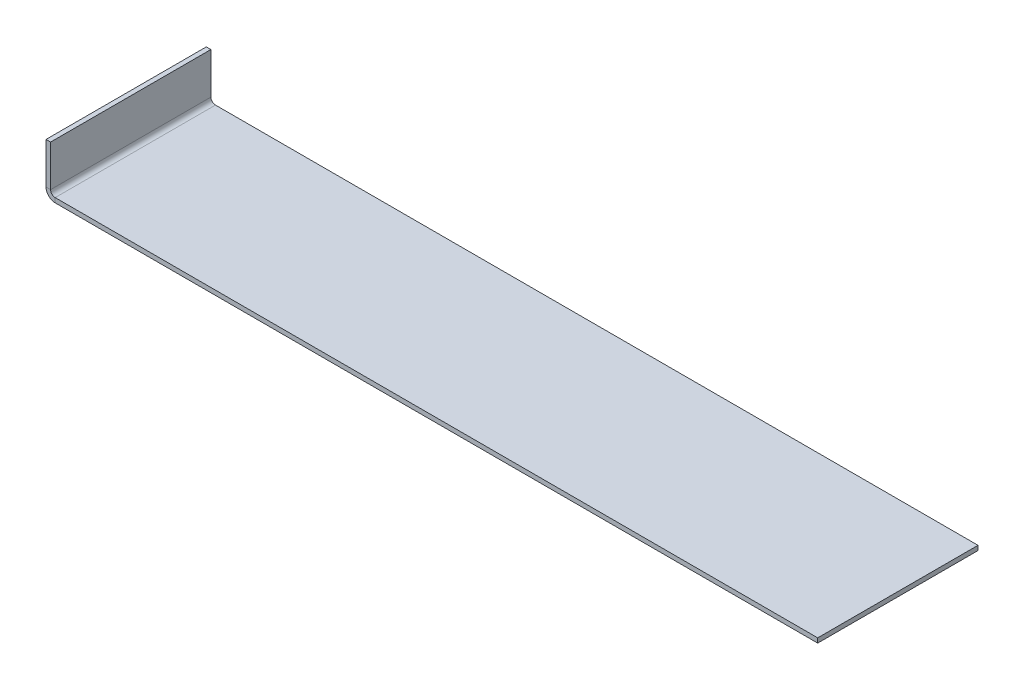
ISO-10303-21;
HEADER;
FILE_DESCRIPTION(('STEP AP214'),'2;1');
FILE_NAME('part.step','',(''),(''),'','','');
FILE_SCHEMA(('AUTOMOTIVE_DESIGN { 1 0 10303 214 1 1 1 1 }'));
ENDSEC;
DATA;
#1=APPLICATION_CONTEXT('core data for automotive mechanical design processes');
#2=APPLICATION_PROTOCOL_DEFINITION('international standard','automotive_design',2000,#1);
#3=PRODUCT_CONTEXT('',#1,'mechanical');
#4=PRODUCT('Part','Part','',(#3));
#5=PRODUCT_RELATED_PRODUCT_CATEGORY('part','',(#4));
#6=PRODUCT_DEFINITION_FORMATION('','',#4);
#7=PRODUCT_DEFINITION_CONTEXT('part definition',#1,'design');
#8=PRODUCT_DEFINITION('design','',#6,#7);
#9=PRODUCT_DEFINITION_SHAPE('','',#8);
#10=(LENGTH_UNIT() NAMED_UNIT(*) SI_UNIT(.MILLI.,.METRE.));
#11=(NAMED_UNIT(*) PLANE_ANGLE_UNIT() SI_UNIT($,.RADIAN.));
#12=(NAMED_UNIT(*) SI_UNIT($,.STERADIAN.) SOLID_ANGLE_UNIT());
#13=UNCERTAINTY_MEASURE_WITH_UNIT(LENGTH_MEASURE(1.E-05),#10,'distance_accuracy_value','');
#14=(GEOMETRIC_REPRESENTATION_CONTEXT(3) GLOBAL_UNCERTAINTY_ASSIGNED_CONTEXT((#13)) GLOBAL_UNIT_ASSIGNED_CONTEXT((#10,
#11,#12)) REPRESENTATION_CONTEXT('',''));
#15=CARTESIAN_POINT('',(0.,0.,0.));
#16=DIRECTION('',(0.,0.,1.));
#17=DIRECTION('',(1.,0.,0.));
#18=AXIS2_PLACEMENT_3D('',#15,#16,#17);
#19=CARTESIAN_POINT('',(2.,0.,35.));
#20=DIRECTION('',(0.,0.,1.));
#21=DIRECTION('',(1.,0.,0.));
#22=AXIS2_PLACEMENT_3D('',#19,#20,#21);
#23=PLANE('',#22);
#24=DIRECTION('',(0.,-1.,0.));
#25=VECTOR('',#24,1.);
#26=CARTESIAN_POINT('',(2.,0.,35.));
#27=LINE('',#26,#25);
#28=CARTESIAN_POINT('',(2.,0.,35.));
#29=VERTEX_POINT('',#28);
#30=CARTESIAN_POINT('',(2.,-2.,35.));
#31=VERTEX_POINT('',#30);
#32=EDGE_CURVE('E11',#29,#31,#27,.T.);
#33=ORIENTED_EDGE('',*,*,#32,.F.);
#34=CARTESIAN_POINT('',(2.,2.,35.));
#35=DIRECTION('',(0.,0.,-1.));
#36=DIRECTION('',(-1.,0.,0.));
#37=AXIS2_PLACEMENT_3D('',#34,#35,#36);
#38=CIRCLE('',#37,2.);
#39=CARTESIAN_POINT('',(0.,2.,35.));
#40=VERTEX_POINT('',#39);
#41=EDGE_CURVE('E138',#40,#29,#38,.F.);
#42=ORIENTED_EDGE('',*,*,#41,.F.);
#43=DIRECTION('',(1.,0.,0.));
#44=VECTOR('',#43,1.);
#45=CARTESIAN_POINT('',(-2.,2.,35.));
#46=LINE('',#45,#44);
#47=CARTESIAN_POINT('',(-2.,2.,35.));
#48=VERTEX_POINT('',#47);
#49=EDGE_CURVE('E49',#48,#40,#46,.T.);
#50=ORIENTED_EDGE('',*,*,#49,.F.);
#51=CARTESIAN_POINT('',(2.,2.,35.));
#52=DIRECTION('',(0.,0.,1.));
#53=DIRECTION('',(1.,0.,0.));
#54=AXIS2_PLACEMENT_3D('',#51,#52,#53);
#55=CIRCLE('',#54,4.);
#56=EDGE_CURVE('E131',#48,#31,#55,.T.);
#57=ORIENTED_EDGE('',*,*,#56,.T.);
#58=EDGE_LOOP('',(#33,#42,#50,#57));
#59=FACE_BOUND('',#58,.T.);
#60=ADVANCED_FACE('F41',(#59),#23,.T.);
#61=CARTESIAN_POINT('',(-2.,2.,35.));
#62=DIRECTION('',(0.,0.,1.));
#63=DIRECTION('',(1.,0.,0.));
#64=AXIS2_PLACEMENT_3D('',#61,#62,#63);
#65=PLANE('',#64);
#66=DIRECTION('',(1.,0.,0.));
#67=VECTOR('',#66,1.);
#68=CARTESIAN_POINT('',(0.,0.,35.));
#69=LINE('',#68,#67);
#70=CARTESIAN_POINT('',(335.,0.,35.));
#71=VERTEX_POINT('',#70);
#72=EDGE_CURVE('E187',#29,#71,#69,.T.);
#73=ORIENTED_EDGE('',*,*,#72,.F.);
#74=ORIENTED_EDGE('',*,*,#32,.T.);
#75=DIRECTION('',(1.,0.,0.));
#76=VECTOR('',#75,1.);
#77=CARTESIAN_POINT('',(0.,-2.,35.));
#78=LINE('',#77,#76);
#79=CARTESIAN_POINT('',(335.,-2.,35.));
#80=VERTEX_POINT('',#79);
#81=EDGE_CURVE('E97',#31,#80,#78,.T.);
#82=ORIENTED_EDGE('',*,*,#81,.T.);
#83=DIRECTION('',(0.,-1.,0.));
#84=VECTOR('',#83,1.);
#85=CARTESIAN_POINT('',(335.,0.,35.));
#86=LINE('',#85,#84);
#87=EDGE_CURVE('E344',#71,#80,#86,.T.);
#88=ORIENTED_EDGE('',*,*,#87,.F.);
#89=EDGE_LOOP('',(#73,#74,#82,#88));
#90=FACE_BOUND('',#89,.T.);
#91=ADVANCED_FACE('F195',(#90),#65,.T.);
#92=CARTESIAN_POINT('',(0.,2.,-35.));
#93=DIRECTION('',(0.,0.,-1.));
#94=DIRECTION('',(-1.,0.,0.));
#95=AXIS2_PLACEMENT_3D('',#92,#93,#94);
#96=PLANE('',#95);
#97=DIRECTION('',(-1.,0.,0.));
#98=VECTOR('',#97,1.);
#99=CARTESIAN_POINT('',(0.,2.,-35.));
#100=LINE('',#99,#98);
#101=CARTESIAN_POINT('',(0.,2.,-35.));
#102=VERTEX_POINT('',#101);
#103=CARTESIAN_POINT('',(-2.,2.,-35.));
#104=VERTEX_POINT('',#103);
#105=EDGE_CURVE('E84',#102,#104,#100,.T.);
#106=ORIENTED_EDGE('',*,*,#105,.F.);
#107=CARTESIAN_POINT('',(2.,2.,-35.));
#108=DIRECTION('',(0.,0.,-1.));
#109=DIRECTION('',(-1.,0.,0.));
#110=AXIS2_PLACEMENT_3D('',#107,#108,#109);
#111=CIRCLE('',#110,2.);
#112=CARTESIAN_POINT('',(2.,0.,-35.));
#113=VERTEX_POINT('',#112);
#114=EDGE_CURVE('E153',#102,#113,#111,.F.);
#115=ORIENTED_EDGE('',*,*,#114,.T.);
#116=DIRECTION('',(0.,1.,0.));
#117=VECTOR('',#116,1.);
#118=CARTESIAN_POINT('',(2.,-2.,-35.));
#119=LINE('',#118,#117);
#120=CARTESIAN_POINT('',(2.,-2.,-35.));
#121=VERTEX_POINT('',#120);
#122=EDGE_CURVE('E91',#121,#113,#119,.T.);
#123=ORIENTED_EDGE('',*,*,#122,.F.);
#124=CARTESIAN_POINT('',(2.,2.,-35.));
#125=DIRECTION('',(0.,0.,1.));
#126=DIRECTION('',(1.,0.,0.));
#127=AXIS2_PLACEMENT_3D('',#124,#125,#126);
#128=CIRCLE('',#127,4.);
#129=EDGE_CURVE('E160',#104,#121,#128,.T.);
#130=ORIENTED_EDGE('',*,*,#129,.F.);
#131=EDGE_LOOP('',(#106,#115,#123,#130));
#132=FACE_BOUND('',#131,.T.);
#133=ADVANCED_FACE('F193',(#132),#96,.T.);
#134=CARTESIAN_POINT('',(2.,-2.,-35.));
#135=DIRECTION('',(0.,0.,-1.));
#136=DIRECTION('',(-1.,0.,0.));
#137=AXIS2_PLACEMENT_3D('',#134,#135,#136);
#138=PLANE('',#137);
#139=DIRECTION('',(0.,-1.,0.));
#140=VECTOR('',#139,1.);
#141=CARTESIAN_POINT('',(0.,20.,-35.));
#142=LINE('',#141,#140);
#143=CARTESIAN_POINT('',(0.,20.,-35.));
#144=VERTEX_POINT('',#143);
#145=EDGE_CURVE('E155',#144,#102,#142,.T.);
#146=ORIENTED_EDGE('',*,*,#145,.T.);
#147=ORIENTED_EDGE('',*,*,#105,.T.);
#148=DIRECTION('',(0.,1.,0.));
#149=VECTOR('',#148,1.);
#150=CARTESIAN_POINT('',(-2.,20.,-35.));
#151=LINE('',#150,#149);
#152=CARTESIAN_POINT('',(-2.,20.,-35.));
#153=VERTEX_POINT('',#152);
#154=EDGE_CURVE('E158',#153,#104,#151,.F.);
#155=ORIENTED_EDGE('',*,*,#154,.F.);
#156=DIRECTION('',(1.,0.,0.));
#157=VECTOR('',#156,1.);
#158=CARTESIAN_POINT('',(-2.,20.,-35.));
#159=LINE('',#158,#157);
#160=EDGE_CURVE('E119',#153,#144,#159,.T.);
#161=ORIENTED_EDGE('',*,*,#160,.T.);
#162=EDGE_LOOP('',(#146,#147,#155,#161));
#163=FACE_BOUND('',#162,.T.);
#164=ADVANCED_FACE('F189',(#163),#138,.T.);
#165=CARTESIAN_POINT('',(0.,-2.,35.));
#166=DIRECTION('',(0.,1.,0.));
#167=DIRECTION('',(0.,0.,1.));
#168=AXIS2_PLACEMENT_3D('',#165,#166,#167);
#169=PLANE('',#168);
#170=DIRECTION('',(1.,0.,0.));
#171=VECTOR('',#170,1.);
#172=CARTESIAN_POINT('',(0.,-2.,-35.));
#173=LINE('',#172,#171);
#174=CARTESIAN_POINT('',(335.,-2.,-35.));
#175=VERTEX_POINT('',#174);
#176=EDGE_CURVE('E144',#121,#175,#173,.T.);
#177=ORIENTED_EDGE('',*,*,#176,.T.);
#178=DIRECTION('',(0.,0.,-1.));
#179=VECTOR('',#178,1.);
#180=CARTESIAN_POINT('',(335.,-2.,35.));
#181=LINE('',#180,#179);
#182=EDGE_CURVE('E174',#80,#175,#181,.T.);
#183=ORIENTED_EDGE('',*,*,#182,.F.);
#184=ORIENTED_EDGE('',*,*,#81,.F.);
#185=DIRECTION('',(0.,0.,-1.));
#186=VECTOR('',#185,1.);
#187=CARTESIAN_POINT('',(2.,-2.,35.));
#188=LINE('',#187,#186);
#189=EDGE_CURVE('E143',#31,#121,#188,.T.);
#190=ORIENTED_EDGE('',*,*,#189,.T.);
#191=EDGE_LOOP('',(#177,#183,#184,#190));
#192=FACE_BOUND('',#191,.T.);
#193=ADVANCED_FACE('F201',(#192),#169,.F.);
#194=CARTESIAN_POINT('',(335.,0.,35.));
#195=DIRECTION('',(1.,0.,0.));
#196=DIRECTION('',(0.,0.,-1.));
#197=AXIS2_PLACEMENT_3D('',#194,#195,#196);
#198=PLANE('',#197);
#199=DIRECTION('',(0.,-1.,0.));
#200=VECTOR('',#199,1.);
#201=CARTESIAN_POINT('',(335.,0.,-35.));
#202=LINE('',#201,#200);
#203=CARTESIAN_POINT('',(335.,0.,-35.));
#204=VERTEX_POINT('',#203);
#205=EDGE_CURVE('E147',#204,#175,#202,.T.);
#206=ORIENTED_EDGE('',*,*,#205,.F.);
#207=DIRECTION('',(0.,0.,-1.));
#208=VECTOR('',#207,1.);
#209=CARTESIAN_POINT('',(335.,0.,35.));
#210=LINE('',#209,#208);
#211=EDGE_CURVE('E172',#71,#204,#210,.T.);
#212=ORIENTED_EDGE('',*,*,#211,.F.);
#213=ORIENTED_EDGE('',*,*,#87,.T.);
#214=ORIENTED_EDGE('',*,*,#182,.T.);
#215=EDGE_LOOP('',(#206,#212,#213,#214));
#216=FACE_BOUND('',#215,.T.);
#217=ADVANCED_FACE('F234',(#216),#198,.T.);
#218=CARTESIAN_POINT('',(0.,0.,35.));
#219=DIRECTION('',(0.,1.,0.));
#220=DIRECTION('',(0.,0.,1.));
#221=AXIS2_PLACEMENT_3D('',#218,#219,#220);
#222=PLANE('',#221);
#223=DIRECTION('',(1.,0.,0.));
#224=VECTOR('',#223,1.);
#225=CARTESIAN_POINT('',(0.,0.,-35.));
#226=LINE('',#225,#224);
#227=EDGE_CURVE('E150',#113,#204,#226,.T.);
#228=ORIENTED_EDGE('',*,*,#227,.F.);
#229=DIRECTION('',(0.,0.,-1.));
#230=VECTOR('',#229,1.);
#231=CARTESIAN_POINT('',(2.,0.,35.));
#232=LINE('',#231,#230);
#233=EDGE_CURVE('E169',#29,#113,#232,.T.);
#234=ORIENTED_EDGE('',*,*,#233,.F.);
#235=ORIENTED_EDGE('',*,*,#72,.T.);
#236=ORIENTED_EDGE('',*,*,#211,.T.);
#237=EDGE_LOOP('',(#228,#234,#235,#236));
#238=FACE_BOUND('',#237,.T.);
#239=ADVANCED_FACE('F245',(#238),#222,.T.);
#240=CARTESIAN_POINT('',(2.,2.,35.));
#241=DIRECTION('',(0.,0.,-1.));
#242=DIRECTION('',(-1.,0.,0.));
#243=AXIS2_PLACEMENT_3D('',#240,#241,#242);
#244=CYLINDRICAL_SURFACE('',#243,2.);
#245=ORIENTED_EDGE('',*,*,#114,.F.);
#246=DIRECTION('',(0.,0.,-1.));
#247=VECTOR('',#246,1.);
#248=CARTESIAN_POINT('',(0.,2.,35.));
#249=LINE('',#248,#247);
#250=EDGE_CURVE('E166',#40,#102,#249,.T.);
#251=ORIENTED_EDGE('',*,*,#250,.F.);
#252=ORIENTED_EDGE('',*,*,#41,.T.);
#253=ORIENTED_EDGE('',*,*,#233,.T.);
#254=EDGE_LOOP('',(#245,#251,#252,#253));
#255=FACE_BOUND('',#254,.T.);
#256=ADVANCED_FACE('F183',(#255),#244,.F.);
#257=CARTESIAN_POINT('',(0.,20.,35.));
#258=DIRECTION('',(1.,0.,0.));
#259=DIRECTION('',(0.,0.,-1.));
#260=AXIS2_PLACEMENT_3D('',#257,#258,#259);
#261=PLANE('',#260);
#262=ORIENTED_EDGE('',*,*,#145,.F.);
#263=DIRECTION('',(0.,0.,-1.));
#264=VECTOR('',#263,1.);
#265=CARTESIAN_POINT('',(0.,20.,35.));
#266=LINE('',#265,#264);
#267=CARTESIAN_POINT('',(0.,20.,35.));
#268=VERTEX_POINT('',#267);
#269=EDGE_CURVE('E121',#268,#144,#266,.T.);
#270=ORIENTED_EDGE('',*,*,#269,.F.);
#271=DIRECTION('',(0.,-1.,0.));
#272=VECTOR('',#271,1.);
#273=CARTESIAN_POINT('',(0.,20.,35.));
#274=LINE('',#273,#272);
#275=EDGE_CURVE('E136',#268,#40,#274,.T.);
#276=ORIENTED_EDGE('',*,*,#275,.T.);
#277=ORIENTED_EDGE('',*,*,#250,.T.);
#278=EDGE_LOOP('',(#262,#270,#276,#277));
#279=FACE_BOUND('',#278,.T.);
#280=ADVANCED_FACE('F188',(#279),#261,.T.);
#281=CARTESIAN_POINT('',(-2.,20.,35.));
#282=DIRECTION('',(0.,1.,0.));
#283=DIRECTION('',(0.,0.,1.));
#284=AXIS2_PLACEMENT_3D('',#281,#282,#283);
#285=PLANE('',#284);
#286=ORIENTED_EDGE('',*,*,#160,.F.);
#287=DIRECTION('',(0.,0.,-1.));
#288=VECTOR('',#287,1.);
#289=CARTESIAN_POINT('',(-2.,20.,35.));
#290=LINE('',#289,#288);
#291=CARTESIAN_POINT('',(-2.,20.,35.));
#292=VERTEX_POINT('',#291);
#293=EDGE_CURVE('E113',#292,#153,#290,.T.);
#294=ORIENTED_EDGE('',*,*,#293,.F.);
#295=DIRECTION('',(1.,0.,0.));
#296=VECTOR('',#295,1.);
#297=CARTESIAN_POINT('',(-2.,20.,35.));
#298=LINE('',#297,#296);
#299=EDGE_CURVE('E117',#292,#268,#298,.T.);
#300=ORIENTED_EDGE('',*,*,#299,.T.);
#301=ORIENTED_EDGE('',*,*,#269,.T.);
#302=EDGE_LOOP('',(#286,#294,#300,#301));
#303=FACE_BOUND('',#302,.T.);
#304=ADVANCED_FACE('F115',(#303),#285,.T.);
#305=CARTESIAN_POINT('',(-2.,20.,35.));
#306=DIRECTION('',(1.,0.,0.));
#307=DIRECTION('',(0.,0.,-1.));
#308=AXIS2_PLACEMENT_3D('',#305,#306,#307);
#309=PLANE('',#308);
#310=ORIENTED_EDGE('',*,*,#154,.T.);
#311=DIRECTION('',(0.,0.,-1.));
#312=VECTOR('',#311,1.);
#313=CARTESIAN_POINT('',(-2.,2.,35.));
#314=LINE('',#313,#312);
#315=EDGE_CURVE('E122',#48,#104,#314,.T.);
#316=ORIENTED_EDGE('',*,*,#315,.F.);
#317=DIRECTION('',(0.,1.,0.));
#318=VECTOR('',#317,1.);
#319=CARTESIAN_POINT('',(-2.,20.,35.));
#320=LINE('',#319,#318);
#321=EDGE_CURVE('E126',#292,#48,#320,.F.);
#322=ORIENTED_EDGE('',*,*,#321,.F.);
#323=ORIENTED_EDGE('',*,*,#293,.T.);
#324=EDGE_LOOP('',(#310,#316,#322,#323));
#325=FACE_BOUND('',#324,.T.);
#326=ADVANCED_FACE('F127',(#325),#309,.F.);
#327=CARTESIAN_POINT('',(2.,2.,35.));
#328=DIRECTION('',(0.,0.,-1.));
#329=DIRECTION('',(-1.,0.,0.));
#330=AXIS2_PLACEMENT_3D('',#327,#328,#329);
#331=CYLINDRICAL_SURFACE('',#330,4.);
#332=ORIENTED_EDGE('',*,*,#129,.T.);
#333=ORIENTED_EDGE('',*,*,#189,.F.);
#334=ORIENTED_EDGE('',*,*,#56,.F.);
#335=ORIENTED_EDGE('',*,*,#315,.T.);
#336=EDGE_LOOP('',(#332,#333,#334,#335));
#337=FACE_BOUND('',#336,.T.);
#338=ADVANCED_FACE('F191',(#337),#331,.T.);
#339=CARTESIAN_POINT('',(2.,2.,35.));
#340=DIRECTION('',(0.,0.,-1.));
#341=DIRECTION('',(-1.,0.,0.));
#342=AXIS2_PLACEMENT_3D('',#339,#340,#341);
#343=PLANE('',#342);
#344=ORIENTED_EDGE('',*,*,#321,.T.);
#345=ORIENTED_EDGE('',*,*,#49,.T.);
#346=ORIENTED_EDGE('',*,*,#275,.F.);
#347=ORIENTED_EDGE('',*,*,#299,.F.);
#348=EDGE_LOOP('',(#344,#345,#346,#347));
#349=FACE_BOUND('',#348,.T.);
#350=ADVANCED_FACE('F134',(#349),#343,.F.);
#351=CARTESIAN_POINT('',(2.,2.,-35.));
#352=DIRECTION('',(0.,0.,-1.));
#353=DIRECTION('',(-1.,0.,0.));
#354=AXIS2_PLACEMENT_3D('',#351,#352,#353);
#355=PLANE('',#354);
#356=ORIENTED_EDGE('',*,*,#176,.F.);
#357=ORIENTED_EDGE('',*,*,#122,.T.);
#358=ORIENTED_EDGE('',*,*,#227,.T.);
#359=ORIENTED_EDGE('',*,*,#205,.T.);
#360=EDGE_LOOP('',(#356,#357,#358,#359));
#361=FACE_BOUND('',#360,.T.);
#362=ADVANCED_FACE('F311',(#361),#355,.T.);
#363=CLOSED_SHELL('',(#60,#91,#133,#164,#193,#217,#239,#256,#280,#304,#326,#338,#350,#362));
#364=MANIFOLD_SOLID_BREP('B2',#363);
#365=ADVANCED_BREP_SHAPE_REPRESENTATION('',(#18,#364),#14);
#366=SHAPE_DEFINITION_REPRESENTATION(#9,#365);
ENDSEC;
END-ISO-10303-21;
